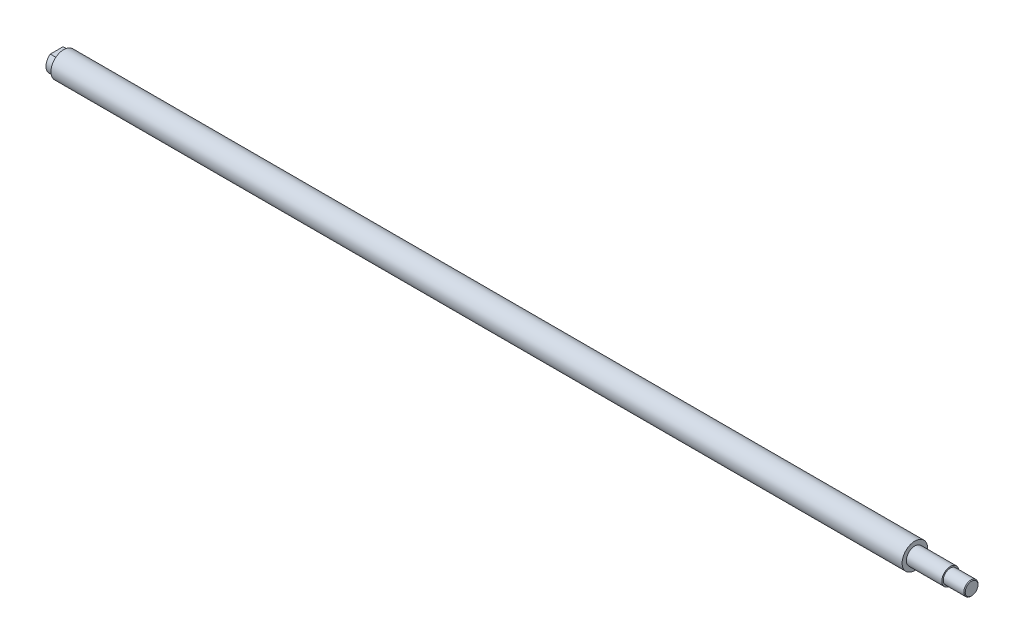
ISO-10303-21;
HEADER;
FILE_DESCRIPTION(('STEP AP214'),'2;1');
FILE_NAME('part.step','',(''),(''),'','','');
FILE_SCHEMA(('AUTOMOTIVE_DESIGN { 1 0 10303 214 1 1 1 1 }'));
ENDSEC;
DATA;
#1=APPLICATION_CONTEXT('core data for automotive mechanical design processes');
#2=APPLICATION_PROTOCOL_DEFINITION('international standard','automotive_design',2000,#1);
#3=PRODUCT_CONTEXT('',#1,'mechanical');
#4=PRODUCT('Part','Part','',(#3));
#5=PRODUCT_RELATED_PRODUCT_CATEGORY('part','',(#4));
#6=PRODUCT_DEFINITION_FORMATION('','',#4);
#7=PRODUCT_DEFINITION_CONTEXT('part definition',#1,'design');
#8=PRODUCT_DEFINITION('design','',#6,#7);
#9=PRODUCT_DEFINITION_SHAPE('','',#8);
#10=(LENGTH_UNIT() NAMED_UNIT(*) SI_UNIT(.MILLI.,.METRE.));
#11=(NAMED_UNIT(*) PLANE_ANGLE_UNIT() SI_UNIT($,.RADIAN.));
#12=(NAMED_UNIT(*) SI_UNIT($,.STERADIAN.) SOLID_ANGLE_UNIT());
#13=UNCERTAINTY_MEASURE_WITH_UNIT(LENGTH_MEASURE(1.E-05),#10,'distance_accuracy_value','');
#14=(GEOMETRIC_REPRESENTATION_CONTEXT(3) GLOBAL_UNCERTAINTY_ASSIGNED_CONTEXT((#13)) GLOBAL_UNIT_ASSIGNED_CONTEXT((#10,
#11,#12)) REPRESENTATION_CONTEXT('',''));
#15=CARTESIAN_POINT('',(0.,0.,0.));
#16=DIRECTION('',(0.,0.,1.));
#17=DIRECTION('',(1.,0.,0.));
#18=AXIS2_PLACEMENT_3D('',#15,#16,#17);
#19=CARTESIAN_POINT('',(-640.,0.,0.));
#20=DIRECTION('',(1.,0.,0.));
#21=DIRECTION('',(0.,0.,-1.));
#22=AXIS2_PLACEMENT_3D('',#19,#20,#21);
#23=PLANE('',#22);
#24=CARTESIAN_POINT('',(-640.,0.,0.));
#25=DIRECTION('',(-1.,0.,0.));
#26=DIRECTION('',(0.,0.,1.));
#27=AXIS2_PLACEMENT_3D('',#24,#25,#26);
#28=CIRCLE('',#27,9.);
#29=CARTESIAN_POINT('',(-640.,0.,9.));
#30=VERTEX_POINT('',#29);
#31=EDGE_CURVE('E92',#30,#30,#28,.T.);
#32=ORIENTED_EDGE('',*,*,#31,.T.);
#33=EDGE_LOOP('',(#32));
#34=FACE_BOUND('',#33,.T.);
#35=CARTESIAN_POINT('',(-640.,0.,0.));
#36=DIRECTION('',(-1.,0.,0.));
#37=DIRECTION('',(0.,0.,1.));
#38=AXIS2_PLACEMENT_3D('',#35,#36,#37);
#39=CIRCLE('',#38,7.5);
#40=CARTESIAN_POINT('',(-640.,6.01068594102995,-4.48571672292231));
#41=VERTEX_POINT('',#40);
#42=CARTESIAN_POINT('',(-640.,6.01068594102995,4.48571672292231));
#43=VERTEX_POINT('',#42);
#44=EDGE_CURVE('E63',#41,#43,#39,.T.);
#45=ORIENTED_EDGE('',*,*,#44,.F.);
#46=DIRECTION('',(0.,0.,-1.));
#47=VECTOR('',#46,1.);
#48=CARTESIAN_POINT('',(-640.,6.01068594102995,-4.48571672292231));
#49=LINE('',#48,#47);
#50=EDGE_CURVE('E50',#43,#41,#49,.T.);
#51=ORIENTED_EDGE('',*,*,#50,.F.);
#52=EDGE_LOOP('',(#45,#51));
#53=FACE_BOUND('',#52,.T.);
#54=ADVANCED_FACE('F35',(#34,#53),#23,.F.);
#55=CARTESIAN_POINT('',(0.,5.,0.));
#56=DIRECTION('',(-1.,0.,0.));
#57=DIRECTION('',(0.,0.,1.));
#58=AXIS2_PLACEMENT_3D('',#55,#56,#57);
#59=PLANE('',#58);
#60=CARTESIAN_POINT('',(0.,0.,0.));
#61=DIRECTION('',(-1.,0.,0.));
#62=DIRECTION('',(0.,0.,1.));
#63=AXIS2_PLACEMENT_3D('',#60,#61,#62);
#64=CIRCLE('',#63,4.49999999999989);
#65=CARTESIAN_POINT('',(0.,0.,4.49999999999989));
#66=VERTEX_POINT('',#65);
#67=EDGE_CURVE('E11',#66,#66,#64,.F.);
#68=ORIENTED_EDGE('',*,*,#67,.T.);
#69=EDGE_LOOP('',(#68));
#70=FACE_BOUND('',#69,.T.);
#71=ADVANCED_FACE('F112',(#70),#59,.F.);
#72=CARTESIAN_POINT('',(-640.,0.,0.));
#73=DIRECTION('',(-1.,0.,0.));
#74=DIRECTION('',(0.,0.,1.));
#75=AXIS2_PLACEMENT_3D('',#72,#73,#74);
#76=CYLINDRICAL_SURFACE('',#75,9.);
#77=ORIENTED_EDGE('',*,*,#31,.F.);
#78=EDGE_LOOP('',(#77));
#79=FACE_BOUND('',#78,.T.);
#80=CARTESIAN_POINT('',(-40.,0.,0.));
#81=DIRECTION('',(-1.,0.,0.));
#82=DIRECTION('',(0.,0.,1.));
#83=AXIS2_PLACEMENT_3D('',#80,#81,#82);
#84=CIRCLE('',#83,9.);
#85=CARTESIAN_POINT('',(-40.,0.,9.));
#86=VERTEX_POINT('',#85);
#87=EDGE_CURVE('E89',#86,#86,#84,.T.);
#88=ORIENTED_EDGE('',*,*,#87,.T.);
#89=EDGE_LOOP('',(#88));
#90=FACE_BOUND('',#89,.T.);
#91=ADVANCED_FACE('F119',(#79,#90),#76,.T.);
#92=CARTESIAN_POINT('',(-40.,9.,0.));
#93=DIRECTION('',(-1.,0.,0.));
#94=DIRECTION('',(0.,0.,1.));
#95=AXIS2_PLACEMENT_3D('',#92,#93,#94);
#96=PLANE('',#95);
#97=ORIENTED_EDGE('',*,*,#87,.F.);
#98=EDGE_LOOP('',(#97));
#99=FACE_BOUND('',#98,.T.);
#100=CARTESIAN_POINT('',(-40.,0.,0.));
#101=DIRECTION('',(-1.,0.,0.));
#102=DIRECTION('',(0.,0.,1.));
#103=AXIS2_PLACEMENT_3D('',#100,#101,#102);
#104=CIRCLE('',#103,6.);
#105=CARTESIAN_POINT('',(-40.,0.,6.));
#106=VERTEX_POINT('',#105);
#107=EDGE_CURVE('E86',#106,#106,#104,.T.);
#108=ORIENTED_EDGE('',*,*,#107,.T.);
#109=EDGE_LOOP('',(#108));
#110=FACE_BOUND('',#109,.T.);
#111=ADVANCED_FACE('F124',(#99,#110),#96,.F.);
#112=CARTESIAN_POINT('',(-640.,0.,0.));
#113=DIRECTION('',(-1.,0.,0.));
#114=DIRECTION('',(0.,0.,1.));
#115=AXIS2_PLACEMENT_3D('',#112,#113,#114);
#116=CYLINDRICAL_SURFACE('',#115,6.);
#117=ORIENTED_EDGE('',*,*,#107,.F.);
#118=EDGE_LOOP('',(#117));
#119=FACE_BOUND('',#118,.T.);
#120=CARTESIAN_POINT('',(-15.,0.,0.));
#121=DIRECTION('',(-1.,0.,0.));
#122=DIRECTION('',(0.,0.,1.));
#123=AXIS2_PLACEMENT_3D('',#120,#121,#122);
#124=CIRCLE('',#123,6.);
#125=CARTESIAN_POINT('',(-15.,0.,6.));
#126=VERTEX_POINT('',#125);
#127=EDGE_CURVE('E83',#126,#126,#124,.T.);
#128=ORIENTED_EDGE('',*,*,#127,.T.);
#129=EDGE_LOOP('',(#128));
#130=FACE_BOUND('',#129,.T.);
#131=ADVANCED_FACE('F128',(#119,#130),#116,.T.);
#132=CARTESIAN_POINT('',(-15.,6.,0.));
#133=DIRECTION('',(-1.,0.,0.));
#134=DIRECTION('',(0.,0.,1.));
#135=AXIS2_PLACEMENT_3D('',#132,#133,#134);
#136=PLANE('',#135);
#137=ORIENTED_EDGE('',*,*,#127,.F.);
#138=EDGE_LOOP('',(#137));
#139=FACE_BOUND('',#138,.T.);
#140=CARTESIAN_POINT('',(-15.,0.,0.));
#141=DIRECTION('',(-1.,0.,0.));
#142=DIRECTION('',(0.,0.,1.));
#143=AXIS2_PLACEMENT_3D('',#140,#141,#142);
#144=CIRCLE('',#143,5.);
#145=CARTESIAN_POINT('',(-15.,0.,5.));
#146=VERTEX_POINT('',#145);
#147=EDGE_CURVE('E77',#146,#146,#144,.T.);
#148=ORIENTED_EDGE('',*,*,#147,.T.);
#149=EDGE_LOOP('',(#148));
#150=FACE_BOUND('',#149,.T.);
#151=ADVANCED_FACE('F108',(#139,#150),#136,.F.);
#152=CARTESIAN_POINT('',(-640.,0.,0.));
#153=DIRECTION('',(-1.,0.,0.));
#154=DIRECTION('',(0.,0.,1.));
#155=AXIS2_PLACEMENT_3D('',#152,#153,#154);
#156=CYLINDRICAL_SURFACE('',#155,5.);
#157=CARTESIAN_POINT('',(-0.500000000000056,0.,0.));
#158=DIRECTION('',(-1.,0.,0.));
#159=DIRECTION('',(0.,0.,1.));
#160=AXIS2_PLACEMENT_3D('',#157,#158,#159);
#161=CIRCLE('',#160,5.);
#162=CARTESIAN_POINT('',(-0.500000000000056,0.,5.));
#163=VERTEX_POINT('',#162);
#164=EDGE_CURVE('E44',#163,#163,#161,.T.);
#165=ORIENTED_EDGE('',*,*,#164,.T.);
#166=EDGE_LOOP('',(#165));
#167=FACE_BOUND('',#166,.T.);
#168=ORIENTED_EDGE('',*,*,#147,.F.);
#169=EDGE_LOOP('',(#168));
#170=FACE_BOUND('',#169,.T.);
#171=ADVANCED_FACE('F97',(#167,#170),#156,.T.);
#172=CARTESIAN_POINT('',(-0.500000000000056,0.,0.));
#173=DIRECTION('',(-1.,0.,0.));
#174=DIRECTION('',(0.,0.,1.));
#175=AXIS2_PLACEMENT_3D('',#172,#173,#174);
#176=CONICAL_SURFACE('',#175,5.,0.785398163397499);
#177=ORIENTED_EDGE('',*,*,#67,.F.);
#178=EDGE_LOOP('',(#177));
#179=FACE_BOUND('',#178,.T.);
#180=ORIENTED_EDGE('',*,*,#164,.F.);
#181=EDGE_LOOP('',(#180));
#182=FACE_BOUND('',#181,.T.);
#183=ADVANCED_FACE('F38',(#179,#182),#176,.T.);
#184=CARTESIAN_POINT('',(-645.,0.,0.));
#185=DIRECTION('',(1.,0.,0.));
#186=DIRECTION('',(0.,0.,-1.));
#187=AXIS2_PLACEMENT_3D('',#184,#185,#186);
#188=CYLINDRICAL_SURFACE('',#187,7.5);
#189=ORIENTED_EDGE('',*,*,#44,.T.);
#190=DIRECTION('',(1.,0.,0.));
#191=VECTOR('',#190,1.);
#192=CARTESIAN_POINT('',(-645.,6.01068594102995,4.48571672292231));
#193=LINE('',#192,#191);
#194=CARTESIAN_POINT('',(-645.,6.01068594102995,4.48571672292231));
#195=VERTEX_POINT('',#194);
#196=EDGE_CURVE('E72',#195,#43,#193,.T.);
#197=ORIENTED_EDGE('',*,*,#196,.F.);
#198=CARTESIAN_POINT('',(-645.,0.,0.));
#199=DIRECTION('',(-1.,0.,0.));
#200=DIRECTION('',(0.,0.,1.));
#201=AXIS2_PLACEMENT_3D('',#198,#199,#200);
#202=CIRCLE('',#201,7.5);
#203=CARTESIAN_POINT('',(-645.,6.01068594102995,-4.48571672292231));
#204=VERTEX_POINT('',#203);
#205=EDGE_CURVE('E73',#204,#195,#202,.T.);
#206=ORIENTED_EDGE('',*,*,#205,.F.);
#207=DIRECTION('',(1.,0.,0.));
#208=VECTOR('',#207,1.);
#209=CARTESIAN_POINT('',(-645.,6.01068594102995,-4.48571672292231));
#210=LINE('',#209,#208);
#211=EDGE_CURVE('E70',#204,#41,#210,.T.);
#212=ORIENTED_EDGE('',*,*,#211,.T.);
#213=EDGE_LOOP('',(#189,#197,#206,#212));
#214=FACE_BOUND('',#213,.T.);
#215=ADVANCED_FACE('F75',(#214),#188,.T.);
#216=CARTESIAN_POINT('',(-645.,6.01068594102995,-4.48571672292231));
#217=DIRECTION('',(0.,-1.,0.));
#218=DIRECTION('',(0.,0.,-1.));
#219=AXIS2_PLACEMENT_3D('',#216,#217,#218);
#220=PLANE('',#219);
#221=ORIENTED_EDGE('',*,*,#50,.T.);
#222=ORIENTED_EDGE('',*,*,#211,.F.);
#223=DIRECTION('',(0.,0.,-1.));
#224=VECTOR('',#223,1.);
#225=CARTESIAN_POINT('',(-645.,6.01068594102995,-4.48571672292231));
#226=LINE('',#225,#224);
#227=EDGE_CURVE('E58',#195,#204,#226,.T.);
#228=ORIENTED_EDGE('',*,*,#227,.F.);
#229=ORIENTED_EDGE('',*,*,#196,.T.);
#230=EDGE_LOOP('',(#221,#222,#228,#229));
#231=FACE_BOUND('',#230,.T.);
#232=ADVANCED_FACE('F69',(#231),#220,.F.);
#233=CARTESIAN_POINT('',(-645.,0.,0.));
#234=DIRECTION('',(-1.,0.,0.));
#235=DIRECTION('',(0.,0.,1.));
#236=AXIS2_PLACEMENT_3D('',#233,#234,#235);
#237=PLANE('',#236);
#238=ORIENTED_EDGE('',*,*,#205,.T.);
#239=ORIENTED_EDGE('',*,*,#227,.T.);
#240=EDGE_LOOP('',(#238,#239));
#241=FACE_BOUND('',#240,.T.);
#242=ADVANCED_FACE('F138',(#241),#237,.T.);
#243=CLOSED_SHELL('',(#54,#71,#91,#111,#131,#151,#171,#183,#215,#232,#242));
#244=MANIFOLD_SOLID_BREP('B2',#243);
#245=ADVANCED_BREP_SHAPE_REPRESENTATION('',(#18,#244),#14);
#246=SHAPE_DEFINITION_REPRESENTATION(#9,#245);
ENDSEC;
END-ISO-10303-21;
